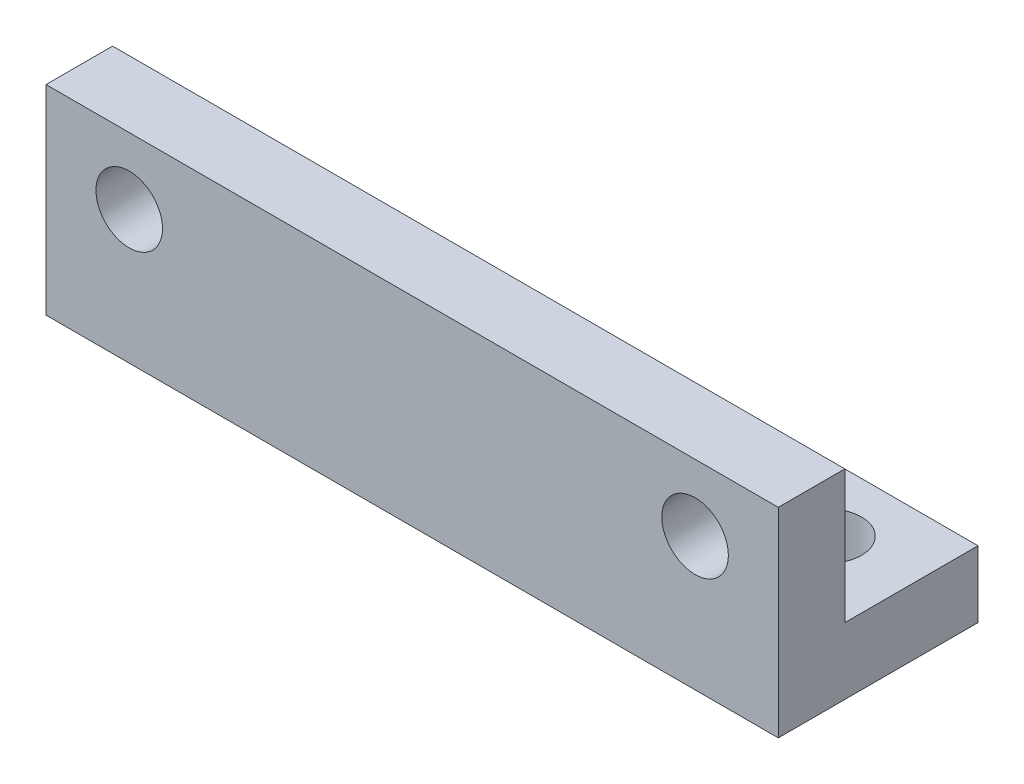
ISO-10303-21;
HEADER;
FILE_DESCRIPTION(('STEP AP214'),'2;1');
FILE_NAME('part.step','',(''),(''),'','','');
FILE_SCHEMA(('AUTOMOTIVE_DESIGN { 1 0 10303 214 1 1 1 1 }'));
ENDSEC;
DATA;
#1=APPLICATION_CONTEXT('core data for automotive mechanical design processes');
#2=APPLICATION_PROTOCOL_DEFINITION('international standard','automotive_design',2000,#1);
#3=PRODUCT_CONTEXT('',#1,'mechanical');
#4=PRODUCT('Part','Part','',(#3));
#5=PRODUCT_RELATED_PRODUCT_CATEGORY('part','',(#4));
#6=PRODUCT_DEFINITION_FORMATION('','',#4);
#7=PRODUCT_DEFINITION_CONTEXT('part definition',#1,'design');
#8=PRODUCT_DEFINITION('design','',#6,#7);
#9=PRODUCT_DEFINITION_SHAPE('','',#8);
#10=(LENGTH_UNIT() NAMED_UNIT(*) SI_UNIT(.MILLI.,.METRE.));
#11=(NAMED_UNIT(*) PLANE_ANGLE_UNIT() SI_UNIT($,.RADIAN.));
#12=(NAMED_UNIT(*) SI_UNIT($,.STERADIAN.) SOLID_ANGLE_UNIT());
#13=UNCERTAINTY_MEASURE_WITH_UNIT(LENGTH_MEASURE(1.E-05),#10,'distance_accuracy_value','');
#14=(GEOMETRIC_REPRESENTATION_CONTEXT(3) GLOBAL_UNCERTAINTY_ASSIGNED_CONTEXT((#13)) GLOBAL_UNIT_ASSIGNED_CONTEXT((#10,
#11,#12)) REPRESENTATION_CONTEXT('',''));
#15=CARTESIAN_POINT('',(0.,0.,0.));
#16=DIRECTION('',(0.,0.,1.));
#17=DIRECTION('',(1.,0.,0.));
#18=AXIS2_PLACEMENT_3D('',#15,#16,#17);
#19=CARTESIAN_POINT('',(11.,0.,-6.));
#20=DIRECTION('',(0.,1.,0.));
#21=DIRECTION('',(0.,0.,1.));
#22=AXIS2_PLACEMENT_3D('',#19,#20,#21);
#23=PLANE('',#22);
#24=CARTESIAN_POINT('',(-8.5,0.,-4.));
#25=DIRECTION('',(0.,-1.,0.));
#26=DIRECTION('',(0.,0.,-1.));
#27=AXIS2_PLACEMENT_3D('',#24,#25,#26);
#28=CIRCLE('',#27,1.);
#29=CARTESIAN_POINT('',(-8.5,0.,-5.));
#30=VERTEX_POINT('',#29);
#31=EDGE_CURVE('E164',#30,#30,#28,.T.);
#32=ORIENTED_EDGE('',*,*,#31,.F.);
#33=EDGE_LOOP('',(#32));
#34=FACE_BOUND('',#33,.T.);
#35=CARTESIAN_POINT('',(8.5,0.,-4.));
#36=DIRECTION('',(0.,-1.,0.));
#37=DIRECTION('',(0.,0.,1.));
#38=AXIS2_PLACEMENT_3D('',#35,#36,#37);
#39=CIRCLE('',#38,1.);
#40=CARTESIAN_POINT('',(8.5,0.,-5.));
#41=VERTEX_POINT('',#40);
#42=EDGE_CURVE('E167',#41,#41,#39,.T.);
#43=ORIENTED_EDGE('',*,*,#42,.F.);
#44=EDGE_LOOP('',(#43));
#45=FACE_BOUND('',#44,.T.);
#46=DIRECTION('',(0.,0.,-1.));
#47=VECTOR('',#46,1.);
#48=CARTESIAN_POINT('',(-11.,0.,-6.));
#49=LINE('',#48,#47);
#50=CARTESIAN_POINT('',(-11.,0.,0.));
#51=VERTEX_POINT('',#50);
#52=CARTESIAN_POINT('',(-11.,0.,-6.));
#53=VERTEX_POINT('',#52);
#54=EDGE_CURVE('E118',#51,#53,#49,.T.);
#55=ORIENTED_EDGE('',*,*,#54,.T.);
#56=DIRECTION('',(-1.,0.,0.));
#57=VECTOR('',#56,1.);
#58=CARTESIAN_POINT('',(11.,0.,-6.));
#59=LINE('',#58,#57);
#60=CARTESIAN_POINT('',(11.,0.,-6.));
#61=VERTEX_POINT('',#60);
#62=EDGE_CURVE('E11',#61,#53,#59,.T.);
#63=ORIENTED_EDGE('',*,*,#62,.F.);
#64=DIRECTION('',(0.,0.,-1.));
#65=VECTOR('',#64,1.);
#66=CARTESIAN_POINT('',(11.,0.,-6.));
#67=LINE('',#66,#65);
#68=CARTESIAN_POINT('',(11.,0.,0.));
#69=VERTEX_POINT('',#68);
#70=EDGE_CURVE('E129',#69,#61,#67,.T.);
#71=ORIENTED_EDGE('',*,*,#70,.F.);
#72=DIRECTION('',(-1.,0.,0.));
#73=VECTOR('',#72,1.);
#74=CARTESIAN_POINT('',(11.,0.,0.));
#75=LINE('',#74,#73);
#76=EDGE_CURVE('E114',#69,#51,#75,.T.);
#77=ORIENTED_EDGE('',*,*,#76,.T.);
#78=EDGE_LOOP('',(#55,#63,#71,#77));
#79=FACE_BOUND('',#78,.T.);
#80=ADVANCED_FACE('F34',(#34,#45,#79),#23,.F.);
#81=CARTESIAN_POINT('',(11.,2.,-6.));
#82=DIRECTION('',(0.,0.,1.));
#83=DIRECTION('',(1.,0.,0.));
#84=AXIS2_PLACEMENT_3D('',#81,#82,#83);
#85=PLANE('',#84);
#86=DIRECTION('',(0.,1.,0.));
#87=VECTOR('',#86,1.);
#88=CARTESIAN_POINT('',(-11.,2.,-6.));
#89=LINE('',#88,#87);
#90=CARTESIAN_POINT('',(-11.,2.,-6.));
#91=VERTEX_POINT('',#90);
#92=EDGE_CURVE('E121',#53,#91,#89,.T.);
#93=ORIENTED_EDGE('',*,*,#92,.T.);
#94=DIRECTION('',(-1.,0.,0.));
#95=VECTOR('',#94,1.);
#96=CARTESIAN_POINT('',(11.,2.,-6.));
#97=LINE('',#96,#95);
#98=CARTESIAN_POINT('',(11.,2.,-6.));
#99=VERTEX_POINT('',#98);
#100=EDGE_CURVE('E42',#99,#91,#97,.T.);
#101=ORIENTED_EDGE('',*,*,#100,.F.);
#102=DIRECTION('',(0.,1.,0.));
#103=VECTOR('',#102,1.);
#104=CARTESIAN_POINT('',(11.,2.,-6.));
#105=LINE('',#104,#103);
#106=EDGE_CURVE('E87',#61,#99,#105,.T.);
#107=ORIENTED_EDGE('',*,*,#106,.F.);
#108=ORIENTED_EDGE('',*,*,#62,.T.);
#109=EDGE_LOOP('',(#93,#101,#107,#108));
#110=FACE_BOUND('',#109,.T.);
#111=ADVANCED_FACE('F156',(#110),#85,.F.);
#112=CARTESIAN_POINT('',(11.,2.,-2.));
#113=DIRECTION('',(0.,-1.,0.));
#114=DIRECTION('',(0.,0.,-1.));
#115=AXIS2_PLACEMENT_3D('',#112,#113,#114);
#116=PLANE('',#115);
#117=CARTESIAN_POINT('',(-8.5,2.,-4.));
#118=DIRECTION('',(0.,-1.,0.));
#119=DIRECTION('',(0.,0.,-1.));
#120=AXIS2_PLACEMENT_3D('',#117,#118,#119);
#121=CIRCLE('',#120,1.);
#122=CARTESIAN_POINT('',(-8.5,2.,-5.));
#123=VERTEX_POINT('',#122);
#124=EDGE_CURVE('E174',#123,#123,#121,.F.);
#125=ORIENTED_EDGE('',*,*,#124,.F.);
#126=EDGE_LOOP('',(#125));
#127=FACE_BOUND('',#126,.T.);
#128=CARTESIAN_POINT('',(8.5,2.,-4.));
#129=DIRECTION('',(0.,-1.,0.));
#130=DIRECTION('',(0.,0.,-1.));
#131=AXIS2_PLACEMENT_3D('',#128,#129,#130);
#132=CIRCLE('',#131,1.);
#133=CARTESIAN_POINT('',(8.5,2.,-5.));
#134=VERTEX_POINT('',#133);
#135=EDGE_CURVE('E169',#134,#134,#132,.F.);
#136=ORIENTED_EDGE('',*,*,#135,.F.);
#137=EDGE_LOOP('',(#136));
#138=FACE_BOUND('',#137,.T.);
#139=DIRECTION('',(0.,0.,1.));
#140=VECTOR('',#139,1.);
#141=CARTESIAN_POINT('',(-11.,2.,-2.));
#142=LINE('',#141,#140);
#143=CARTESIAN_POINT('',(-11.,2.,-2.));
#144=VERTEX_POINT('',#143);
#145=EDGE_CURVE('E124',#91,#144,#142,.T.);
#146=ORIENTED_EDGE('',*,*,#145,.T.);
#147=DIRECTION('',(-1.,0.,0.));
#148=VECTOR('',#147,1.);
#149=CARTESIAN_POINT('',(11.,2.,-2.));
#150=LINE('',#149,#148);
#151=CARTESIAN_POINT('',(11.,2.,-2.));
#152=VERTEX_POINT('',#151);
#153=EDGE_CURVE('E109',#152,#144,#150,.T.);
#154=ORIENTED_EDGE('',*,*,#153,.F.);
#155=DIRECTION('',(0.,0.,1.));
#156=VECTOR('',#155,1.);
#157=CARTESIAN_POINT('',(11.,2.,-2.));
#158=LINE('',#157,#156);
#159=EDGE_CURVE('E100',#99,#152,#158,.T.);
#160=ORIENTED_EDGE('',*,*,#159,.F.);
#161=ORIENTED_EDGE('',*,*,#100,.T.);
#162=EDGE_LOOP('',(#146,#154,#160,#161));
#163=FACE_BOUND('',#162,.T.);
#164=ADVANCED_FACE('F135',(#127,#138,#163),#116,.F.);
#165=CARTESIAN_POINT('',(11.,6.,-2.));
#166=DIRECTION('',(0.,0.,1.));
#167=DIRECTION('',(0.,-1.,0.));
#168=AXIS2_PLACEMENT_3D('',#165,#166,#167);
#169=PLANE('',#168);
#170=CARTESIAN_POINT('',(-8.5,4.,-2.));
#171=DIRECTION('',(0.,0.,1.));
#172=DIRECTION('',(0.,-1.,0.));
#173=AXIS2_PLACEMENT_3D('',#170,#171,#172);
#174=CIRCLE('',#173,1.);
#175=CARTESIAN_POINT('',(-7.5,4.,-2.));
#176=VERTEX_POINT('',#175);
#177=EDGE_CURVE('E122',#176,#176,#174,.F.);
#178=ORIENTED_EDGE('',*,*,#177,.F.);
#179=EDGE_LOOP('',(#178));
#180=FACE_BOUND('',#179,.T.);
#181=CARTESIAN_POINT('',(8.5,4.,-2.));
#182=DIRECTION('',(0.,0.,1.));
#183=DIRECTION('',(0.,-1.,0.));
#184=AXIS2_PLACEMENT_3D('',#181,#182,#183);
#185=CIRCLE('',#184,1.);
#186=CARTESIAN_POINT('',(9.5,4.,-2.));
#187=VERTEX_POINT('',#186);
#188=EDGE_CURVE('E180',#187,#187,#185,.F.);
#189=ORIENTED_EDGE('',*,*,#188,.F.);
#190=EDGE_LOOP('',(#189));
#191=FACE_BOUND('',#190,.T.);
#192=DIRECTION('',(0.,1.,0.));
#193=VECTOR('',#192,1.);
#194=CARTESIAN_POINT('',(-11.,6.,-2.));
#195=LINE('',#194,#193);
#196=CARTESIAN_POINT('',(-11.,6.,-2.));
#197=VERTEX_POINT('',#196);
#198=EDGE_CURVE('E108',#144,#197,#195,.T.);
#199=ORIENTED_EDGE('',*,*,#198,.T.);
#200=DIRECTION('',(-1.,0.,0.));
#201=VECTOR('',#200,1.);
#202=CARTESIAN_POINT('',(11.,6.,-2.));
#203=LINE('',#202,#201);
#204=CARTESIAN_POINT('',(11.,6.,-2.));
#205=VERTEX_POINT('',#204);
#206=EDGE_CURVE('E105',#205,#197,#203,.T.);
#207=ORIENTED_EDGE('',*,*,#206,.F.);
#208=DIRECTION('',(0.,1.,0.));
#209=VECTOR('',#208,1.);
#210=CARTESIAN_POINT('',(11.,6.,-2.));
#211=LINE('',#210,#209);
#212=EDGE_CURVE('E94',#152,#205,#211,.T.);
#213=ORIENTED_EDGE('',*,*,#212,.F.);
#214=ORIENTED_EDGE('',*,*,#153,.T.);
#215=EDGE_LOOP('',(#199,#207,#213,#214));
#216=FACE_BOUND('',#215,.T.);
#217=ADVANCED_FACE('F106',(#180,#191,#216),#169,.F.);
#218=CARTESIAN_POINT('',(11.,6.,0.));
#219=DIRECTION('',(0.,-1.,0.));
#220=DIRECTION('',(0.,0.,-1.));
#221=AXIS2_PLACEMENT_3D('',#218,#219,#220);
#222=PLANE('',#221);
#223=DIRECTION('',(0.,0.,1.));
#224=VECTOR('',#223,1.);
#225=CARTESIAN_POINT('',(-11.,6.,0.));
#226=LINE('',#225,#224);
#227=CARTESIAN_POINT('',(-11.,6.,0.));
#228=VERTEX_POINT('',#227);
#229=EDGE_CURVE('E73',#197,#228,#226,.T.);
#230=ORIENTED_EDGE('',*,*,#229,.T.);
#231=DIRECTION('',(-1.,0.,0.));
#232=VECTOR('',#231,1.);
#233=CARTESIAN_POINT('',(11.,6.,0.));
#234=LINE('',#233,#232);
#235=CARTESIAN_POINT('',(11.,6.,0.));
#236=VERTEX_POINT('',#235);
#237=EDGE_CURVE('E110',#236,#228,#234,.T.);
#238=ORIENTED_EDGE('',*,*,#237,.F.);
#239=DIRECTION('',(0.,0.,1.));
#240=VECTOR('',#239,1.);
#241=CARTESIAN_POINT('',(11.,6.,0.));
#242=LINE('',#241,#240);
#243=EDGE_CURVE('E98',#205,#236,#242,.T.);
#244=ORIENTED_EDGE('',*,*,#243,.F.);
#245=ORIENTED_EDGE('',*,*,#206,.T.);
#246=EDGE_LOOP('',(#230,#238,#244,#245));
#247=FACE_BOUND('',#246,.T.);
#248=ADVANCED_FACE('F112',(#247),#222,.F.);
#249=CARTESIAN_POINT('',(11.,0.,0.));
#250=DIRECTION('',(0.,0.,-1.));
#251=DIRECTION('',(-1.,0.,0.));
#252=AXIS2_PLACEMENT_3D('',#249,#250,#251);
#253=PLANE('',#252);
#254=CARTESIAN_POINT('',(-8.5,4.,0.));
#255=DIRECTION('',(0.,0.,1.));
#256=DIRECTION('',(1.,0.,0.));
#257=AXIS2_PLACEMENT_3D('',#254,#255,#256);
#258=CIRCLE('',#257,1.);
#259=CARTESIAN_POINT('',(-7.5,4.,0.));
#260=VERTEX_POINT('',#259);
#261=EDGE_CURVE('E177',#260,#260,#258,.T.);
#262=ORIENTED_EDGE('',*,*,#261,.F.);
#263=EDGE_LOOP('',(#262));
#264=FACE_BOUND('',#263,.T.);
#265=CARTESIAN_POINT('',(8.5,4.,0.));
#266=DIRECTION('',(0.,0.,1.));
#267=DIRECTION('',(-1.,0.,0.));
#268=AXIS2_PLACEMENT_3D('',#265,#266,#267);
#269=CIRCLE('',#268,1.);
#270=CARTESIAN_POINT('',(9.5,4.,0.));
#271=VERTEX_POINT('',#270);
#272=EDGE_CURVE('E183',#271,#271,#269,.T.);
#273=ORIENTED_EDGE('',*,*,#272,.F.);
#274=EDGE_LOOP('',(#273));
#275=FACE_BOUND('',#274,.T.);
#276=DIRECTION('',(0.,-1.,0.));
#277=VECTOR('',#276,1.);
#278=CARTESIAN_POINT('',(-11.,0.,0.));
#279=LINE('',#278,#277);
#280=EDGE_CURVE('E79',#228,#51,#279,.T.);
#281=ORIENTED_EDGE('',*,*,#280,.T.);
#282=ORIENTED_EDGE('',*,*,#76,.F.);
#283=DIRECTION('',(0.,-1.,0.));
#284=VECTOR('',#283,1.);
#285=CARTESIAN_POINT('',(11.,0.,0.));
#286=LINE('',#285,#284);
#287=EDGE_CURVE('E50',#236,#69,#286,.T.);
#288=ORIENTED_EDGE('',*,*,#287,.F.);
#289=ORIENTED_EDGE('',*,*,#237,.T.);
#290=EDGE_LOOP('',(#281,#282,#288,#289));
#291=FACE_BOUND('',#290,.T.);
#292=ADVANCED_FACE('F142',(#264,#275,#291),#253,.F.);
#293=CARTESIAN_POINT('',(11.,0.,0.));
#294=DIRECTION('',(-1.,0.,0.));
#295=DIRECTION('',(0.,0.,1.));
#296=AXIS2_PLACEMENT_3D('',#293,#294,#295);
#297=PLANE('',#296);
#298=ORIENTED_EDGE('',*,*,#70,.T.);
#299=ORIENTED_EDGE('',*,*,#106,.T.);
#300=ORIENTED_EDGE('',*,*,#159,.T.);
#301=ORIENTED_EDGE('',*,*,#212,.T.);
#302=ORIENTED_EDGE('',*,*,#243,.T.);
#303=ORIENTED_EDGE('',*,*,#287,.T.);
#304=EDGE_LOOP('',(#298,#299,#300,#301,#302,#303));
#305=FACE_BOUND('',#304,.T.);
#306=ADVANCED_FACE('F96',(#305),#297,.F.);
#307=CARTESIAN_POINT('',(-11.,0.,0.));
#308=DIRECTION('',(-1.,0.,0.));
#309=DIRECTION('',(0.,0.,1.));
#310=AXIS2_PLACEMENT_3D('',#307,#308,#309);
#311=PLANE('',#310);
#312=ORIENTED_EDGE('',*,*,#54,.F.);
#313=ORIENTED_EDGE('',*,*,#280,.F.);
#314=ORIENTED_EDGE('',*,*,#229,.F.);
#315=ORIENTED_EDGE('',*,*,#198,.F.);
#316=ORIENTED_EDGE('',*,*,#145,.F.);
#317=ORIENTED_EDGE('',*,*,#92,.F.);
#318=EDGE_LOOP('',(#312,#313,#314,#315,#316,#317));
#319=FACE_BOUND('',#318,.T.);
#320=ADVANCED_FACE('F138',(#319),#311,.T.);
#321=CARTESIAN_POINT('',(8.5,4.,-6.001));
#322=DIRECTION('',(0.,0.,1.));
#323=DIRECTION('',(1.,0.,0.));
#324=AXIS2_PLACEMENT_3D('',#321,#322,#323);
#325=CYLINDRICAL_SURFACE('',#324,1.);
#326=CARTESIAN_POINT('',(9.5,4.,0.));
#327=CARTESIAN_POINT('',(9.5,4.,-0.0208333333333333));
#328=CARTESIAN_POINT('',(9.5,4.,-0.0416666666666667));
#329=CARTESIAN_POINT('',(9.5,4.,-0.0833333333333334));
#330=CARTESIAN_POINT('',(9.5,4.,-0.104166666666667));
#331=CARTESIAN_POINT('',(9.5,4.,-0.145833333333333));
#332=CARTESIAN_POINT('',(9.5,4.,-0.166666666666667));
#333=CARTESIAN_POINT('',(9.5,4.,-0.208333333333334));
#334=CARTESIAN_POINT('',(9.5,4.,-0.229166666666667));
#335=CARTESIAN_POINT('',(9.5,4.,-0.270833333333334));
#336=CARTESIAN_POINT('',(9.5,4.,-0.291666666666667));
#337=CARTESIAN_POINT('',(9.5,4.,-0.333333333333334));
#338=CARTESIAN_POINT('',(9.5,4.,-0.354166666666667));
#339=CARTESIAN_POINT('',(9.5,4.,-0.395833333333334));
#340=CARTESIAN_POINT('',(9.5,4.,-0.416666666666667));
#341=CARTESIAN_POINT('',(9.5,4.,-0.458333333333334));
#342=CARTESIAN_POINT('',(9.5,4.,-0.479166666666667));
#343=CARTESIAN_POINT('',(9.5,4.,-0.520833333333334));
#344=CARTESIAN_POINT('',(9.5,4.,-0.541666666666667));
#345=CARTESIAN_POINT('',(9.5,4.,-0.583333333333334));
#346=CARTESIAN_POINT('',(9.5,4.,-0.604166666666667));
#347=CARTESIAN_POINT('',(9.5,4.,-0.645833333333333));
#348=CARTESIAN_POINT('',(9.5,4.,-0.666666666666666));
#349=CARTESIAN_POINT('',(9.5,4.,-0.708333333333333));
#350=CARTESIAN_POINT('',(9.5,4.,-0.729166666666667));
#351=CARTESIAN_POINT('',(9.5,4.,-0.770833333333333));
#352=CARTESIAN_POINT('',(9.5,4.,-0.791666666666667));
#353=CARTESIAN_POINT('',(9.5,4.,-0.833333333333333));
#354=CARTESIAN_POINT('',(9.5,4.,-0.854166666666667));
#355=CARTESIAN_POINT('',(9.5,4.,-0.895833333333333));
#356=CARTESIAN_POINT('',(9.5,4.,-0.916666666666667));
#357=CARTESIAN_POINT('',(9.5,4.,-0.958333333333333));
#358=CARTESIAN_POINT('',(9.5,4.,-0.979166666666667));
#359=CARTESIAN_POINT('',(9.5,4.,-1.02083333333333));
#360=CARTESIAN_POINT('',(9.5,4.,-1.04166666666667));
#361=CARTESIAN_POINT('',(9.5,4.,-1.08333333333333));
#362=CARTESIAN_POINT('',(9.5,4.,-1.10416666666667));
#363=CARTESIAN_POINT('',(9.5,4.,-1.14583333333333));
#364=CARTESIAN_POINT('',(9.5,4.,-1.16666666666667));
#365=CARTESIAN_POINT('',(9.5,4.,-1.20833333333333));
#366=CARTESIAN_POINT('',(9.5,4.,-1.22916666666667));
#367=CARTESIAN_POINT('',(9.5,4.,-1.27083333333333));
#368=CARTESIAN_POINT('',(9.5,4.,-1.29166666666667));
#369=CARTESIAN_POINT('',(9.5,4.,-1.33333333333333));
#370=CARTESIAN_POINT('',(9.5,4.,-1.35416666666667));
#371=CARTESIAN_POINT('',(9.5,4.,-1.39583333333333));
#372=CARTESIAN_POINT('',(9.5,4.,-1.41666666666667));
#373=CARTESIAN_POINT('',(9.5,4.,-1.45833333333333));
#374=CARTESIAN_POINT('',(9.5,4.,-1.47916666666667));
#375=CARTESIAN_POINT('',(9.5,4.,-1.52083333333333));
#376=CARTESIAN_POINT('',(9.5,4.,-1.54166666666667));
#377=CARTESIAN_POINT('',(9.5,4.,-1.58333333333333));
#378=CARTESIAN_POINT('',(9.5,4.,-1.60416666666667));
#379=CARTESIAN_POINT('',(9.5,4.,-1.64583333333333));
#380=CARTESIAN_POINT('',(9.5,4.,-1.66666666666667));
#381=CARTESIAN_POINT('',(9.5,4.,-1.70833333333333));
#382=CARTESIAN_POINT('',(9.5,4.,-1.72916666666667));
#383=CARTESIAN_POINT('',(9.5,4.,-1.77083333333333));
#384=CARTESIAN_POINT('',(9.5,4.,-1.79166666666667));
#385=CARTESIAN_POINT('',(9.5,4.,-1.83333333333333));
#386=CARTESIAN_POINT('',(9.5,4.,-1.85416666666667));
#387=CARTESIAN_POINT('',(9.5,4.,-1.89583333333333));
#388=CARTESIAN_POINT('',(9.5,4.,-1.91666666666667));
#389=CARTESIAN_POINT('',(9.5,4.,-1.95833333333333));
#390=CARTESIAN_POINT('',(9.5,4.,-1.97916666666667));
#391=CARTESIAN_POINT('',(9.5,4.,-2.));
#392=B_SPLINE_CURVE_WITH_KNOTS('',3,(#326,#327,#328,#329,#330,#331,#332,#333,#334,#335,#336,
#337,#338,#339,#340,#341,#342,#343,#344,#345,#346,#347,#348,#349,#350,#351,#352,#353,#354,#355,
#356,#357,#358,#359,#360,#361,#362,#363,#364,#365,#366,#367,#368,#369,#370,#371,#372,#373,#374,
#375,#376,#377,#378,#379,#380,#381,#382,#383,#384,#385,#386,#387,#388,#389,#390,#391),
.UNSPECIFIED.,.F.,.F.,(4,2,2,2,2,2,2,2,2,2,2,2,2,2,2,2,2,2,2,2,2,2,2,2,2,2,2,2,2,2,2,2,4),(0.,
0.0625000000000001,0.125,0.1875,0.25,0.3125,0.375,0.4375,0.5,0.5625,0.625,0.6875,0.75,0.8125,
0.875,0.9375,1.,1.0625,1.125,1.1875,1.25,1.3125,1.375,1.4375,1.5,1.5625,1.625,1.6875,1.75,
1.8125,1.875,1.9375,2.),.UNSPECIFIED.);
#393=EDGE_CURVE('BSEAM191',#271,#187,#392,.T.);
#394=ORIENTED_EDGE('',*,*,#272,.T.);
#395=ORIENTED_EDGE('',*,*,#188,.T.);
#396=ORIENTED_EDGE('',*,*,#393,.T.);
#397=ORIENTED_EDGE('',*,*,#393,.F.);
#398=EDGE_LOOP('',(#394,#396,#395,#397));
#399=FACE_BOUND('',#398,.T.);
#400=ADVANCED_FACE('F191',(#399),#325,.F.);
#401=CARTESIAN_POINT('',(-8.5,4.,-6.001));
#402=DIRECTION('',(0.,0.,1.));
#403=DIRECTION('',(1.,0.,0.));
#404=AXIS2_PLACEMENT_3D('',#401,#402,#403);
#405=CYLINDRICAL_SURFACE('',#404,1.);
#406=CARTESIAN_POINT('',(-7.5,4.,0.));
#407=CARTESIAN_POINT('',(-7.5,4.,-0.0208333333333333));
#408=CARTESIAN_POINT('',(-7.5,4.,-0.0416666666666667));
#409=CARTESIAN_POINT('',(-7.5,4.,-0.0833333333333334));
#410=CARTESIAN_POINT('',(-7.5,4.,-0.104166666666667));
#411=CARTESIAN_POINT('',(-7.5,4.,-0.145833333333333));
#412=CARTESIAN_POINT('',(-7.5,4.,-0.166666666666667));
#413=CARTESIAN_POINT('',(-7.5,4.,-0.208333333333334));
#414=CARTESIAN_POINT('',(-7.5,4.,-0.229166666666667));
#415=CARTESIAN_POINT('',(-7.5,4.,-0.270833333333334));
#416=CARTESIAN_POINT('',(-7.5,4.,-0.291666666666667));
#417=CARTESIAN_POINT('',(-7.5,4.,-0.333333333333334));
#418=CARTESIAN_POINT('',(-7.5,4.,-0.354166666666667));
#419=CARTESIAN_POINT('',(-7.5,4.,-0.395833333333334));
#420=CARTESIAN_POINT('',(-7.5,4.,-0.416666666666667));
#421=CARTESIAN_POINT('',(-7.5,4.,-0.458333333333334));
#422=CARTESIAN_POINT('',(-7.5,4.,-0.479166666666667));
#423=CARTESIAN_POINT('',(-7.5,4.,-0.520833333333334));
#424=CARTESIAN_POINT('',(-7.5,4.,-0.541666666666667));
#425=CARTESIAN_POINT('',(-7.5,4.,-0.583333333333334));
#426=CARTESIAN_POINT('',(-7.5,4.,-0.604166666666667));
#427=CARTESIAN_POINT('',(-7.5,4.,-0.645833333333333));
#428=CARTESIAN_POINT('',(-7.5,4.,-0.666666666666666));
#429=CARTESIAN_POINT('',(-7.5,4.,-0.708333333333333));
#430=CARTESIAN_POINT('',(-7.5,4.,-0.729166666666667));
#431=CARTESIAN_POINT('',(-7.5,4.,-0.770833333333333));
#432=CARTESIAN_POINT('',(-7.5,4.,-0.791666666666667));
#433=CARTESIAN_POINT('',(-7.5,4.,-0.833333333333333));
#434=CARTESIAN_POINT('',(-7.5,4.,-0.854166666666667));
#435=CARTESIAN_POINT('',(-7.5,4.,-0.895833333333333));
#436=CARTESIAN_POINT('',(-7.5,4.,-0.916666666666667));
#437=CARTESIAN_POINT('',(-7.5,4.,-0.958333333333333));
#438=CARTESIAN_POINT('',(-7.5,4.,-0.979166666666667));
#439=CARTESIAN_POINT('',(-7.5,4.,-1.02083333333333));
#440=CARTESIAN_POINT('',(-7.5,4.,-1.04166666666667));
#441=CARTESIAN_POINT('',(-7.5,4.,-1.08333333333333));
#442=CARTESIAN_POINT('',(-7.5,4.,-1.10416666666667));
#443=CARTESIAN_POINT('',(-7.5,4.,-1.14583333333333));
#444=CARTESIAN_POINT('',(-7.5,4.,-1.16666666666667));
#445=CARTESIAN_POINT('',(-7.5,4.,-1.20833333333333));
#446=CARTESIAN_POINT('',(-7.5,4.,-1.22916666666667));
#447=CARTESIAN_POINT('',(-7.5,4.,-1.27083333333333));
#448=CARTESIAN_POINT('',(-7.5,4.,-1.29166666666667));
#449=CARTESIAN_POINT('',(-7.5,4.,-1.33333333333333));
#450=CARTESIAN_POINT('',(-7.5,4.,-1.35416666666667));
#451=CARTESIAN_POINT('',(-7.5,4.,-1.39583333333333));
#452=CARTESIAN_POINT('',(-7.5,4.,-1.41666666666667));
#453=CARTESIAN_POINT('',(-7.5,4.,-1.45833333333333));
#454=CARTESIAN_POINT('',(-7.5,4.,-1.47916666666667));
#455=CARTESIAN_POINT('',(-7.5,4.,-1.52083333333333));
#456=CARTESIAN_POINT('',(-7.5,4.,-1.54166666666667));
#457=CARTESIAN_POINT('',(-7.5,4.,-1.58333333333333));
#458=CARTESIAN_POINT('',(-7.5,4.,-1.60416666666667));
#459=CARTESIAN_POINT('',(-7.5,4.,-1.64583333333333));
#460=CARTESIAN_POINT('',(-7.5,4.,-1.66666666666667));
#461=CARTESIAN_POINT('',(-7.5,4.,-1.70833333333333));
#462=CARTESIAN_POINT('',(-7.5,4.,-1.72916666666667));
#463=CARTESIAN_POINT('',(-7.5,4.,-1.77083333333333));
#464=CARTESIAN_POINT('',(-7.5,4.,-1.79166666666667));
#465=CARTESIAN_POINT('',(-7.5,4.,-1.83333333333333));
#466=CARTESIAN_POINT('',(-7.5,4.,-1.85416666666667));
#467=CARTESIAN_POINT('',(-7.5,4.,-1.89583333333333));
#468=CARTESIAN_POINT('',(-7.5,4.,-1.91666666666667));
#469=CARTESIAN_POINT('',(-7.5,4.,-1.95833333333333));
#470=CARTESIAN_POINT('',(-7.5,4.,-1.97916666666667));
#471=CARTESIAN_POINT('',(-7.5,4.,-2.));
#472=B_SPLINE_CURVE_WITH_KNOTS('',3,(#406,#407,#408,#409,#410,#411,#412,#413,#414,#415,#416,
#417,#418,#419,#420,#421,#422,#423,#424,#425,#426,#427,#428,#429,#430,#431,#432,#433,#434,#435,
#436,#437,#438,#439,#440,#441,#442,#443,#444,#445,#446,#447,#448,#449,#450,#451,#452,#453,#454,
#455,#456,#457,#458,#459,#460,#461,#462,#463,#464,#465,#466,#467,#468,#469,#470,#471),
.UNSPECIFIED.,.F.,.F.,(4,2,2,2,2,2,2,2,2,2,2,2,2,2,2,2,2,2,2,2,2,2,2,2,2,2,2,2,2,2,2,2,4),(0.,
0.0625000000000001,0.125,0.1875,0.25,0.3125,0.375,0.4375,0.5,0.5625,0.625,0.6875,0.75,0.8125,
0.875,0.9375,1.,1.0625,1.125,1.1875,1.25,1.3125,1.375,1.4375,1.5,1.5625,1.625,1.6875,1.75,
1.8125,1.875,1.9375,2.),.UNSPECIFIED.);
#473=EDGE_CURVE('BSEAM203',#260,#176,#472,.T.);
#474=ORIENTED_EDGE('',*,*,#261,.T.);
#475=ORIENTED_EDGE('',*,*,#177,.T.);
#476=ORIENTED_EDGE('',*,*,#473,.T.);
#477=ORIENTED_EDGE('',*,*,#473,.F.);
#478=EDGE_LOOP('',(#474,#476,#475,#477));
#479=FACE_BOUND('',#478,.T.);
#480=ADVANCED_FACE('F203',(#479),#405,.F.);
#481=CARTESIAN_POINT('',(8.5,6.001,-4.));
#482=DIRECTION('',(0.,-1.,0.));
#483=DIRECTION('',(0.,0.,-1.));
#484=AXIS2_PLACEMENT_3D('',#481,#482,#483);
#485=CYLINDRICAL_SURFACE('',#484,1.);
#486=CARTESIAN_POINT('',(8.5,0.,-5.));
#487=CARTESIAN_POINT('',(8.5,0.0208333333333333,-5.));
#488=CARTESIAN_POINT('',(8.5,0.0416666666666667,-5.));
#489=CARTESIAN_POINT('',(8.5,0.0833333333333334,-5.));
#490=CARTESIAN_POINT('',(8.5,0.104166666666667,-5.));
#491=CARTESIAN_POINT('',(8.5,0.145833333333333,-5.));
#492=CARTESIAN_POINT('',(8.5,0.166666666666667,-5.));
#493=CARTESIAN_POINT('',(8.5,0.208333333333334,-5.));
#494=CARTESIAN_POINT('',(8.5,0.229166666666667,-5.));
#495=CARTESIAN_POINT('',(8.5,0.270833333333334,-5.));
#496=CARTESIAN_POINT('',(8.5,0.291666666666667,-5.));
#497=CARTESIAN_POINT('',(8.5,0.333333333333334,-5.));
#498=CARTESIAN_POINT('',(8.5,0.354166666666667,-5.));
#499=CARTESIAN_POINT('',(8.5,0.395833333333334,-5.));
#500=CARTESIAN_POINT('',(8.5,0.416666666666667,-5.));
#501=CARTESIAN_POINT('',(8.5,0.458333333333334,-5.));
#502=CARTESIAN_POINT('',(8.5,0.479166666666667,-5.));
#503=CARTESIAN_POINT('',(8.5,0.520833333333334,-5.));
#504=CARTESIAN_POINT('',(8.5,0.541666666666667,-5.));
#505=CARTESIAN_POINT('',(8.5,0.583333333333334,-5.));
#506=CARTESIAN_POINT('',(8.5,0.604166666666667,-5.));
#507=CARTESIAN_POINT('',(8.5,0.645833333333333,-5.));
#508=CARTESIAN_POINT('',(8.5,0.666666666666666,-5.));
#509=CARTESIAN_POINT('',(8.5,0.708333333333333,-5.));
#510=CARTESIAN_POINT('',(8.5,0.729166666666667,-5.));
#511=CARTESIAN_POINT('',(8.5,0.770833333333333,-5.));
#512=CARTESIAN_POINT('',(8.5,0.791666666666667,-5.));
#513=CARTESIAN_POINT('',(8.5,0.833333333333333,-5.));
#514=CARTESIAN_POINT('',(8.5,0.854166666666667,-5.));
#515=CARTESIAN_POINT('',(8.5,0.895833333333333,-5.));
#516=CARTESIAN_POINT('',(8.5,0.916666666666667,-5.));
#517=CARTESIAN_POINT('',(8.5,0.958333333333333,-5.));
#518=CARTESIAN_POINT('',(8.5,0.979166666666667,-5.));
#519=CARTESIAN_POINT('',(8.5,1.02083333333333,-5.));
#520=CARTESIAN_POINT('',(8.5,1.04166666666667,-5.));
#521=CARTESIAN_POINT('',(8.5,1.08333333333333,-5.));
#522=CARTESIAN_POINT('',(8.5,1.10416666666667,-5.));
#523=CARTESIAN_POINT('',(8.5,1.14583333333333,-5.));
#524=CARTESIAN_POINT('',(8.5,1.16666666666667,-5.));
#525=CARTESIAN_POINT('',(8.5,1.20833333333333,-5.));
#526=CARTESIAN_POINT('',(8.5,1.22916666666667,-5.));
#527=CARTESIAN_POINT('',(8.5,1.27083333333333,-5.));
#528=CARTESIAN_POINT('',(8.5,1.29166666666667,-5.));
#529=CARTESIAN_POINT('',(8.5,1.33333333333333,-5.));
#530=CARTESIAN_POINT('',(8.5,1.35416666666667,-5.));
#531=CARTESIAN_POINT('',(8.5,1.39583333333333,-5.));
#532=CARTESIAN_POINT('',(8.5,1.41666666666667,-5.));
#533=CARTESIAN_POINT('',(8.5,1.45833333333333,-5.));
#534=CARTESIAN_POINT('',(8.5,1.47916666666667,-5.));
#535=CARTESIAN_POINT('',(8.5,1.52083333333333,-5.));
#536=CARTESIAN_POINT('',(8.5,1.54166666666667,-5.));
#537=CARTESIAN_POINT('',(8.5,1.58333333333333,-5.));
#538=CARTESIAN_POINT('',(8.5,1.60416666666667,-5.));
#539=CARTESIAN_POINT('',(8.5,1.64583333333333,-5.));
#540=CARTESIAN_POINT('',(8.5,1.66666666666667,-5.));
#541=CARTESIAN_POINT('',(8.5,1.70833333333333,-5.));
#542=CARTESIAN_POINT('',(8.5,1.72916666666667,-5.));
#543=CARTESIAN_POINT('',(8.5,1.77083333333333,-5.));
#544=CARTESIAN_POINT('',(8.5,1.79166666666667,-5.));
#545=CARTESIAN_POINT('',(8.5,1.83333333333333,-5.));
#546=CARTESIAN_POINT('',(8.5,1.85416666666667,-5.));
#547=CARTESIAN_POINT('',(8.5,1.89583333333333,-5.));
#548=CARTESIAN_POINT('',(8.5,1.91666666666667,-5.));
#549=CARTESIAN_POINT('',(8.5,1.95833333333333,-5.));
#550=CARTESIAN_POINT('',(8.5,1.97916666666667,-5.));
#551=CARTESIAN_POINT('',(8.5,2.,-5.));
#552=B_SPLINE_CURVE_WITH_KNOTS('',3,(#486,#487,#488,#489,#490,#491,#492,#493,#494,#495,#496,
#497,#498,#499,#500,#501,#502,#503,#504,#505,#506,#507,#508,#509,#510,#511,#512,#513,#514,#515,
#516,#517,#518,#519,#520,#521,#522,#523,#524,#525,#526,#527,#528,#529,#530,#531,#532,#533,#534,
#535,#536,#537,#538,#539,#540,#541,#542,#543,#544,#545,#546,#547,#548,#549,#550,#551),
.UNSPECIFIED.,.F.,.F.,(4,2,2,2,2,2,2,2,2,2,2,2,2,2,2,2,2,2,2,2,2,2,2,2,2,2,2,2,2,2,2,2,4),(0.,
0.0625000000000001,0.125,0.1875,0.25,0.3125,0.375,0.4375,0.5,0.5625,0.625,0.6875,0.75,0.8125,
0.875,0.9375,1.,1.0625,1.125,1.1875,1.25,1.3125,1.375,1.4375,1.5,1.5625,1.625,1.6875,1.75,
1.8125,1.875,1.9375,2.),.UNSPECIFIED.);
#553=EDGE_CURVE('BSEAM205',#41,#134,#552,.T.);
#554=ORIENTED_EDGE('',*,*,#42,.T.);
#555=ORIENTED_EDGE('',*,*,#135,.T.);
#556=ORIENTED_EDGE('',*,*,#553,.T.);
#557=ORIENTED_EDGE('',*,*,#553,.F.);
#558=EDGE_LOOP('',(#554,#556,#555,#557));
#559=FACE_BOUND('',#558,.T.);
#560=ADVANCED_FACE('F205',(#559),#485,.F.);
#561=CARTESIAN_POINT('',(-8.5,6.001,-4.));
#562=DIRECTION('',(0.,-1.,0.));
#563=DIRECTION('',(0.,0.,-1.));
#564=AXIS2_PLACEMENT_3D('',#561,#562,#563);
#565=CYLINDRICAL_SURFACE('',#564,1.);
#566=CARTESIAN_POINT('',(-8.5,0.,-5.));
#567=CARTESIAN_POINT('',(-8.5,0.0208333333333333,-5.));
#568=CARTESIAN_POINT('',(-8.5,0.0416666666666667,-5.));
#569=CARTESIAN_POINT('',(-8.5,0.0833333333333334,-5.));
#570=CARTESIAN_POINT('',(-8.5,0.104166666666667,-5.));
#571=CARTESIAN_POINT('',(-8.5,0.145833333333333,-5.));
#572=CARTESIAN_POINT('',(-8.5,0.166666666666667,-5.));
#573=CARTESIAN_POINT('',(-8.5,0.208333333333334,-5.));
#574=CARTESIAN_POINT('',(-8.5,0.229166666666667,-5.));
#575=CARTESIAN_POINT('',(-8.5,0.270833333333334,-5.));
#576=CARTESIAN_POINT('',(-8.5,0.291666666666667,-5.));
#577=CARTESIAN_POINT('',(-8.5,0.333333333333334,-5.));
#578=CARTESIAN_POINT('',(-8.5,0.354166666666667,-5.));
#579=CARTESIAN_POINT('',(-8.5,0.395833333333334,-5.));
#580=CARTESIAN_POINT('',(-8.5,0.416666666666667,-5.));
#581=CARTESIAN_POINT('',(-8.5,0.458333333333334,-5.));
#582=CARTESIAN_POINT('',(-8.5,0.479166666666667,-5.));
#583=CARTESIAN_POINT('',(-8.5,0.520833333333334,-5.));
#584=CARTESIAN_POINT('',(-8.5,0.541666666666667,-5.));
#585=CARTESIAN_POINT('',(-8.5,0.583333333333334,-5.));
#586=CARTESIAN_POINT('',(-8.5,0.604166666666667,-5.));
#587=CARTESIAN_POINT('',(-8.5,0.645833333333333,-5.));
#588=CARTESIAN_POINT('',(-8.5,0.666666666666666,-5.));
#589=CARTESIAN_POINT('',(-8.5,0.708333333333333,-5.));
#590=CARTESIAN_POINT('',(-8.5,0.729166666666667,-5.));
#591=CARTESIAN_POINT('',(-8.5,0.770833333333333,-5.));
#592=CARTESIAN_POINT('',(-8.5,0.791666666666667,-5.));
#593=CARTESIAN_POINT('',(-8.5,0.833333333333333,-5.));
#594=CARTESIAN_POINT('',(-8.5,0.854166666666667,-5.));
#595=CARTESIAN_POINT('',(-8.5,0.895833333333333,-5.));
#596=CARTESIAN_POINT('',(-8.5,0.916666666666667,-5.));
#597=CARTESIAN_POINT('',(-8.5,0.958333333333333,-5.));
#598=CARTESIAN_POINT('',(-8.5,0.979166666666667,-5.));
#599=CARTESIAN_POINT('',(-8.5,1.02083333333333,-5.));
#600=CARTESIAN_POINT('',(-8.5,1.04166666666667,-5.));
#601=CARTESIAN_POINT('',(-8.5,1.08333333333333,-5.));
#602=CARTESIAN_POINT('',(-8.5,1.10416666666667,-5.));
#603=CARTESIAN_POINT('',(-8.5,1.14583333333333,-5.));
#604=CARTESIAN_POINT('',(-8.5,1.16666666666667,-5.));
#605=CARTESIAN_POINT('',(-8.5,1.20833333333333,-5.));
#606=CARTESIAN_POINT('',(-8.5,1.22916666666667,-5.));
#607=CARTESIAN_POINT('',(-8.5,1.27083333333333,-5.));
#608=CARTESIAN_POINT('',(-8.5,1.29166666666667,-5.));
#609=CARTESIAN_POINT('',(-8.5,1.33333333333333,-5.));
#610=CARTESIAN_POINT('',(-8.5,1.35416666666667,-5.));
#611=CARTESIAN_POINT('',(-8.5,1.39583333333333,-5.));
#612=CARTESIAN_POINT('',(-8.5,1.41666666666667,-5.));
#613=CARTESIAN_POINT('',(-8.5,1.45833333333333,-5.));
#614=CARTESIAN_POINT('',(-8.5,1.47916666666667,-5.));
#615=CARTESIAN_POINT('',(-8.5,1.52083333333333,-5.));
#616=CARTESIAN_POINT('',(-8.5,1.54166666666667,-5.));
#617=CARTESIAN_POINT('',(-8.5,1.58333333333333,-5.));
#618=CARTESIAN_POINT('',(-8.5,1.60416666666667,-5.));
#619=CARTESIAN_POINT('',(-8.5,1.64583333333333,-5.));
#620=CARTESIAN_POINT('',(-8.5,1.66666666666667,-5.));
#621=CARTESIAN_POINT('',(-8.5,1.70833333333333,-5.));
#622=CARTESIAN_POINT('',(-8.5,1.72916666666667,-5.));
#623=CARTESIAN_POINT('',(-8.5,1.77083333333333,-5.));
#624=CARTESIAN_POINT('',(-8.5,1.79166666666667,-5.));
#625=CARTESIAN_POINT('',(-8.5,1.83333333333333,-5.));
#626=CARTESIAN_POINT('',(-8.5,1.85416666666667,-5.));
#627=CARTESIAN_POINT('',(-8.5,1.89583333333333,-5.));
#628=CARTESIAN_POINT('',(-8.5,1.91666666666667,-5.));
#629=CARTESIAN_POINT('',(-8.5,1.95833333333333,-5.));
#630=CARTESIAN_POINT('',(-8.5,1.97916666666667,-5.));
#631=CARTESIAN_POINT('',(-8.5,2.,-5.));
#632=B_SPLINE_CURVE_WITH_KNOTS('',3,(#566,#567,#568,#569,#570,#571,#572,#573,#574,#575,#576,
#577,#578,#579,#580,#581,#582,#583,#584,#585,#586,#587,#588,#589,#590,#591,#592,#593,#594,#595,
#596,#597,#598,#599,#600,#601,#602,#603,#604,#605,#606,#607,#608,#609,#610,#611,#612,#613,#614,
#615,#616,#617,#618,#619,#620,#621,#622,#623,#624,#625,#626,#627,#628,#629,#630,#631),
.UNSPECIFIED.,.F.,.F.,(4,2,2,2,2,2,2,2,2,2,2,2,2,2,2,2,2,2,2,2,2,2,2,2,2,2,2,2,2,2,2,2,4),(0.,
0.0625000000000001,0.125,0.1875,0.25,0.3125,0.375,0.4375,0.5,0.5625,0.625,0.6875,0.75,0.8125,
0.875,0.9375,1.,1.0625,1.125,1.1875,1.25,1.3125,1.375,1.4375,1.5,1.5625,1.625,1.6875,1.75,
1.8125,1.875,1.9375,2.),.UNSPECIFIED.);
#633=EDGE_CURVE('BSEAM212',#30,#123,#632,.T.);
#634=ORIENTED_EDGE('',*,*,#31,.T.);
#635=ORIENTED_EDGE('',*,*,#124,.T.);
#636=ORIENTED_EDGE('',*,*,#633,.T.);
#637=ORIENTED_EDGE('',*,*,#633,.F.);
#638=EDGE_LOOP('',(#634,#636,#635,#637));
#639=FACE_BOUND('',#638,.T.);
#640=ADVANCED_FACE('F212',(#639),#565,.F.);
#641=CLOSED_SHELL('',(#80,#111,#164,#217,#248,#292,#306,#320,#400,#480,#560,#640));
#642=MANIFOLD_SOLID_BREP('B2',#641);
#643=ADVANCED_BREP_SHAPE_REPRESENTATION('',(#18,#642),#14);
#644=SHAPE_DEFINITION_REPRESENTATION(#9,#643);
ENDSEC;
END-ISO-10303-21;
